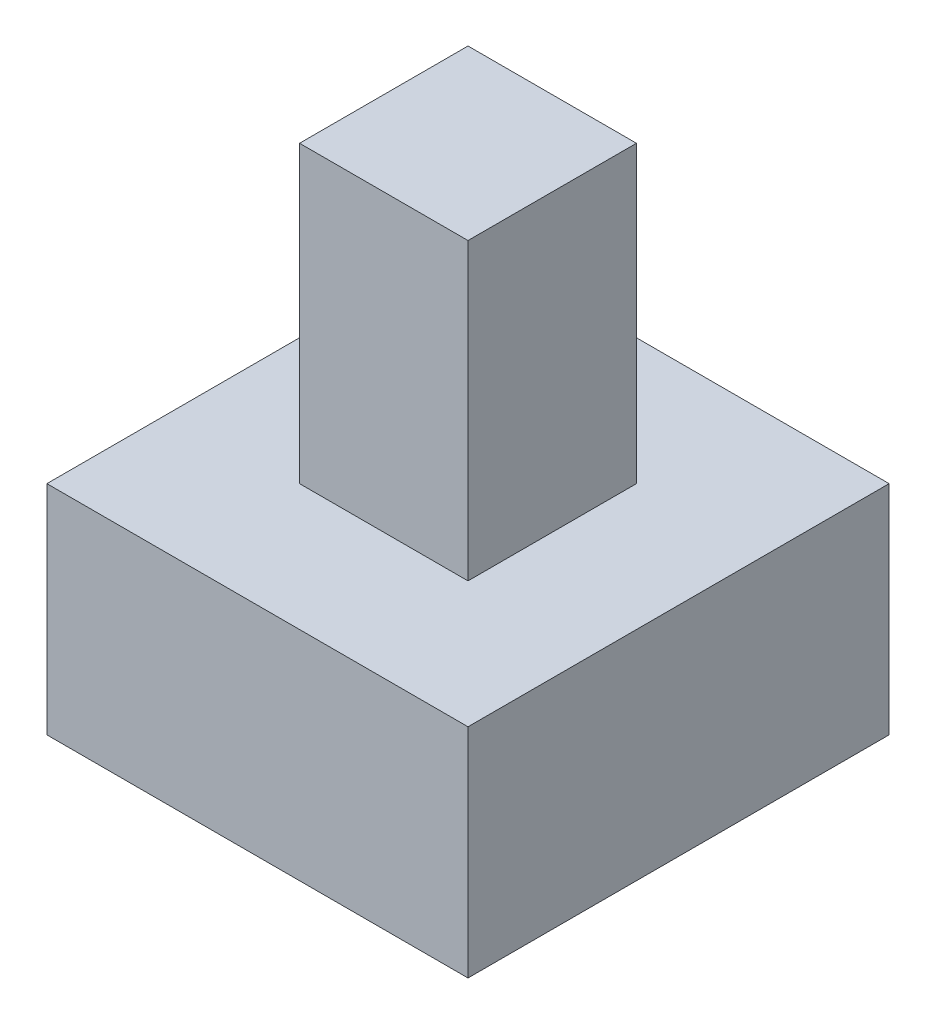
ISO-10303-21;
HEADER;
FILE_DESCRIPTION(('STEP AP214'),'2;1');
FILE_NAME('part.step','',(''),(''),'','','');
FILE_SCHEMA(('AUTOMOTIVE_DESIGN { 1 0 10303 214 1 1 1 1 }'));
ENDSEC;
DATA;
#1=APPLICATION_CONTEXT('core data for automotive mechanical design processes');
#2=APPLICATION_PROTOCOL_DEFINITION('international standard','automotive_design',2000,#1);
#3=PRODUCT_CONTEXT('',#1,'mechanical');
#4=PRODUCT('Part','Part','',(#3));
#5=PRODUCT_RELATED_PRODUCT_CATEGORY('part','',(#4));
#6=PRODUCT_DEFINITION_FORMATION('','',#4);
#7=PRODUCT_DEFINITION_CONTEXT('part definition',#1,'design');
#8=PRODUCT_DEFINITION('design','',#6,#7);
#9=PRODUCT_DEFINITION_SHAPE('','',#8);
#10=(LENGTH_UNIT() NAMED_UNIT(*) SI_UNIT(.MILLI.,.METRE.));
#11=(NAMED_UNIT(*) PLANE_ANGLE_UNIT() SI_UNIT($,.RADIAN.));
#12=(NAMED_UNIT(*) SI_UNIT($,.STERADIAN.) SOLID_ANGLE_UNIT());
#13=UNCERTAINTY_MEASURE_WITH_UNIT(LENGTH_MEASURE(1.E-05),#10,'distance_accuracy_value','');
#14=(GEOMETRIC_REPRESENTATION_CONTEXT(3) GLOBAL_UNCERTAINTY_ASSIGNED_CONTEXT((#13)) GLOBAL_UNIT_ASSIGNED_CONTEXT((#10,
#11,#12)) REPRESENTATION_CONTEXT('',''));
#15=CARTESIAN_POINT('',(0.,0.,0.));
#16=DIRECTION('',(0.,0.,1.));
#17=DIRECTION('',(1.,0.,0.));
#18=AXIS2_PLACEMENT_3D('',#15,#16,#17);
#19=CARTESIAN_POINT('',(-3.,3.1,2.99999999999999));
#20=DIRECTION('',(0.,1.,0.));
#21=DIRECTION('',(0.,0.,1.));
#22=AXIS2_PLACEMENT_3D('',#19,#20,#21);
#23=PLANE('',#22);
#24=DIRECTION('',(0.,0.,1.));
#25=VECTOR('',#24,1.);
#26=CARTESIAN_POINT('',(-3.,3.1,-3.00000000000001));
#27=LINE('',#26,#25);
#28=CARTESIAN_POINT('',(-3.,3.1,-3.00000000000001));
#29=VERTEX_POINT('',#28);
#30=CARTESIAN_POINT('',(-3.,3.1,2.99999999999999));
#31=VERTEX_POINT('',#30);
#32=EDGE_CURVE('E143',#29,#31,#27,.T.);
#33=ORIENTED_EDGE('',*,*,#32,.T.);
#34=DIRECTION('',(1.,0.,0.));
#35=VECTOR('',#34,1.);
#36=CARTESIAN_POINT('',(-3.,3.1,2.99999999999999));
#37=LINE('',#36,#35);
#38=CARTESIAN_POINT('',(3.00000000000002,3.1,2.99999999999999));
#39=VERTEX_POINT('',#38);
#40=EDGE_CURVE('E145',#31,#39,#37,.T.);
#41=ORIENTED_EDGE('',*,*,#40,.T.);
#42=DIRECTION('',(0.,0.,-1.));
#43=VECTOR('',#42,1.);
#44=CARTESIAN_POINT('',(3.,3.1,-3.00000000000001));
#45=LINE('',#44,#43);
#46=CARTESIAN_POINT('',(3.,3.1,-3.00000000000001));
#47=VERTEX_POINT('',#46);
#48=EDGE_CURVE('E147',#39,#47,#45,.T.);
#49=ORIENTED_EDGE('',*,*,#48,.T.);
#50=DIRECTION('',(-1.,0.,0.));
#51=VECTOR('',#50,1.);
#52=CARTESIAN_POINT('',(-3.,3.1,-3.00000000000001));
#53=LINE('',#52,#51);
#54=EDGE_CURVE('E58',#47,#29,#53,.T.);
#55=ORIENTED_EDGE('',*,*,#54,.T.);
#56=EDGE_LOOP('',(#33,#41,#49,#55));
#57=FACE_BOUND('',#56,.T.);
#58=DIRECTION('',(-1.,0.,0.));
#59=VECTOR('',#58,1.);
#60=CARTESIAN_POINT('',(1.2,3.1,-1.2));
#61=LINE('',#60,#59);
#62=CARTESIAN_POINT('',(1.2,3.1,-1.2));
#63=VERTEX_POINT('',#62);
#64=CARTESIAN_POINT('',(-1.2,3.1,-1.2));
#65=VERTEX_POINT('',#64);
#66=EDGE_CURVE('E134',#63,#65,#61,.T.);
#67=ORIENTED_EDGE('',*,*,#66,.F.);
#68=DIRECTION('',(0.,0.,-1.));
#69=VECTOR('',#68,1.);
#70=CARTESIAN_POINT('',(1.2,3.1,1.2));
#71=LINE('',#70,#69);
#72=CARTESIAN_POINT('',(1.2,3.1,1.2));
#73=VERTEX_POINT('',#72);
#74=EDGE_CURVE('E128',#73,#63,#71,.T.);
#75=ORIENTED_EDGE('',*,*,#74,.F.);
#76=DIRECTION('',(1.,0.,0.));
#77=VECTOR('',#76,1.);
#78=CARTESIAN_POINT('',(1.2,3.1,1.2));
#79=LINE('',#78,#77);
#80=CARTESIAN_POINT('',(-1.2,3.1,1.2));
#81=VERTEX_POINT('',#80);
#82=EDGE_CURVE('E107',#81,#73,#79,.T.);
#83=ORIENTED_EDGE('',*,*,#82,.F.);
#84=DIRECTION('',(0.,0.,1.));
#85=VECTOR('',#84,1.);
#86=CARTESIAN_POINT('',(-1.2,3.1,1.2));
#87=LINE('',#86,#85);
#88=EDGE_CURVE('E50',#65,#81,#87,.T.);
#89=ORIENTED_EDGE('',*,*,#88,.F.);
#90=EDGE_LOOP('',(#67,#75,#83,#89));
#91=FACE_BOUND('',#90,.T.);
#92=ADVANCED_FACE('F35',(#57,#91),#23,.T.);
#93=CARTESIAN_POINT('',(-3.,3.1,-3.00000000000001));
#94=DIRECTION('',(1.,0.,0.));
#95=DIRECTION('',(0.,0.,-1.));
#96=AXIS2_PLACEMENT_3D('',#93,#94,#95);
#97=PLANE('',#96);
#98=DIRECTION('',(0.,0.,1.));
#99=VECTOR('',#98,1.);
#100=CARTESIAN_POINT('',(-3.,0.,-3.00000000000001));
#101=LINE('',#100,#99);
#102=CARTESIAN_POINT('',(-3.,0.,-3.00000000000001));
#103=VERTEX_POINT('',#102);
#104=CARTESIAN_POINT('',(-3.,0.,2.99999999999999));
#105=VERTEX_POINT('',#104);
#106=EDGE_CURVE('E121',#103,#105,#101,.T.);
#107=ORIENTED_EDGE('',*,*,#106,.T.);
#108=DIRECTION('',(0.,-1.,0.));
#109=VECTOR('',#108,1.);
#110=CARTESIAN_POINT('',(-3.,3.1,2.99999999999999));
#111=LINE('',#110,#109);
#112=EDGE_CURVE('E12',#31,#105,#111,.T.);
#113=ORIENTED_EDGE('',*,*,#112,.F.);
#114=ORIENTED_EDGE('',*,*,#32,.F.);
#115=DIRECTION('',(0.,-1.,0.));
#116=VECTOR('',#115,1.);
#117=CARTESIAN_POINT('',(-3.,3.1,-3.00000000000001));
#118=LINE('',#117,#116);
#119=EDGE_CURVE('E150',#29,#103,#118,.T.);
#120=ORIENTED_EDGE('',*,*,#119,.T.);
#121=EDGE_LOOP('',(#107,#113,#114,#120));
#122=FACE_BOUND('',#121,.T.);
#123=ADVANCED_FACE('F37',(#122),#97,.F.);
#124=CARTESIAN_POINT('',(-3.,3.1,2.99999999999999));
#125=DIRECTION('',(0.,0.,-1.));
#126=DIRECTION('',(-1.,0.,0.));
#127=AXIS2_PLACEMENT_3D('',#124,#125,#126);
#128=PLANE('',#127);
#129=DIRECTION('',(1.,0.,0.));
#130=VECTOR('',#129,1.);
#131=CARTESIAN_POINT('',(-3.,0.,2.99999999999999));
#132=LINE('',#131,#130);
#133=CARTESIAN_POINT('',(3.00000000000002,0.,2.99999999999999));
#134=VERTEX_POINT('',#133);
#135=EDGE_CURVE('E124',#105,#134,#132,.T.);
#136=ORIENTED_EDGE('',*,*,#135,.T.);
#137=DIRECTION('',(0.,-1.,0.));
#138=VECTOR('',#137,1.);
#139=CARTESIAN_POINT('',(3.00000000000002,3.1,2.99999999999999));
#140=LINE('',#139,#138);
#141=EDGE_CURVE('E43',#39,#134,#140,.T.);
#142=ORIENTED_EDGE('',*,*,#141,.F.);
#143=ORIENTED_EDGE('',*,*,#40,.F.);
#144=ORIENTED_EDGE('',*,*,#112,.T.);
#145=EDGE_LOOP('',(#136,#142,#143,#144));
#146=FACE_BOUND('',#145,.T.);
#147=ADVANCED_FACE('F173',(#146),#128,.F.);
#148=CARTESIAN_POINT('',(3.,3.1,-3.00000000000001));
#149=DIRECTION('',(-1.,0.,0.));
#150=DIRECTION('',(0.,0.,1.));
#151=AXIS2_PLACEMENT_3D('',#148,#149,#150);
#152=PLANE('',#151);
#153=DIRECTION('',(0.,0.,-1.));
#154=VECTOR('',#153,1.);
#155=CARTESIAN_POINT('',(3.,0.,-3.00000000000001));
#156=LINE('',#155,#154);
#157=CARTESIAN_POINT('',(3.,0.,-3.00000000000001));
#158=VERTEX_POINT('',#157);
#159=EDGE_CURVE('E139',#134,#158,#156,.T.);
#160=ORIENTED_EDGE('',*,*,#159,.T.);
#161=DIRECTION('',(0.,-1.,0.));
#162=VECTOR('',#161,1.);
#163=CARTESIAN_POINT('',(3.,3.1,-3.00000000000001));
#164=LINE('',#163,#162);
#165=EDGE_CURVE('E153',#47,#158,#164,.T.);
#166=ORIENTED_EDGE('',*,*,#165,.F.);
#167=ORIENTED_EDGE('',*,*,#48,.F.);
#168=ORIENTED_EDGE('',*,*,#141,.T.);
#169=EDGE_LOOP('',(#160,#166,#167,#168));
#170=FACE_BOUND('',#169,.T.);
#171=ADVANCED_FACE('F160',(#170),#152,.F.);
#172=CARTESIAN_POINT('',(-3.,3.1,-3.00000000000001));
#173=DIRECTION('',(0.,0.,1.));
#174=DIRECTION('',(1.,0.,0.));
#175=AXIS2_PLACEMENT_3D('',#172,#173,#174);
#176=PLANE('',#175);
#177=DIRECTION('',(-1.,0.,0.));
#178=VECTOR('',#177,1.);
#179=CARTESIAN_POINT('',(-3.,0.,-3.00000000000001));
#180=LINE('',#179,#178);
#181=EDGE_CURVE('E141',#158,#103,#180,.T.);
#182=ORIENTED_EDGE('',*,*,#181,.T.);
#183=ORIENTED_EDGE('',*,*,#119,.F.);
#184=ORIENTED_EDGE('',*,*,#54,.F.);
#185=ORIENTED_EDGE('',*,*,#165,.T.);
#186=EDGE_LOOP('',(#182,#183,#184,#185));
#187=FACE_BOUND('',#186,.T.);
#188=ADVANCED_FACE('F168',(#187),#176,.F.);
#189=CARTESIAN_POINT('',(-3.,0.,2.99999999999999));
#190=DIRECTION('',(0.,1.,0.));
#191=DIRECTION('',(0.,0.,1.));
#192=AXIS2_PLACEMENT_3D('',#189,#190,#191);
#193=PLANE('',#192);
#194=ORIENTED_EDGE('',*,*,#106,.F.);
#195=ORIENTED_EDGE('',*,*,#181,.F.);
#196=ORIENTED_EDGE('',*,*,#159,.F.);
#197=ORIENTED_EDGE('',*,*,#135,.F.);
#198=EDGE_LOOP('',(#194,#195,#196,#197));
#199=FACE_BOUND('',#198,.T.);
#200=ADVANCED_FACE('F166',(#199),#193,.F.);
#201=CARTESIAN_POINT('',(1.2,17.9941125496954,1.2));
#202=DIRECTION('',(-1.,0.,0.));
#203=DIRECTION('',(0.,0.,1.));
#204=AXIS2_PLACEMENT_3D('',#201,#202,#203);
#205=PLANE('',#204);
#206=DIRECTION('',(0.,0.,-1.));
#207=VECTOR('',#206,1.);
#208=CARTESIAN_POINT('',(1.2,7.3,1.2));
#209=LINE('',#208,#207);
#210=CARTESIAN_POINT('',(1.2,7.3,1.2));
#211=VERTEX_POINT('',#210);
#212=CARTESIAN_POINT('',(1.2,7.3,-1.2));
#213=VERTEX_POINT('',#212);
#214=EDGE_CURVE('E116',#211,#213,#209,.T.);
#215=ORIENTED_EDGE('',*,*,#214,.F.);
#216=DIRECTION('',(0.,-1.,0.));
#217=VECTOR('',#216,1.);
#218=CARTESIAN_POINT('',(1.2,17.9941125496954,1.2));
#219=LINE('',#218,#217);
#220=EDGE_CURVE('E112',#211,#73,#219,.T.);
#221=ORIENTED_EDGE('',*,*,#220,.T.);
#222=ORIENTED_EDGE('',*,*,#74,.T.);
#223=DIRECTION('',(0.,-1.,0.));
#224=VECTOR('',#223,1.);
#225=CARTESIAN_POINT('',(1.2,17.9941125496954,-1.2));
#226=LINE('',#225,#224);
#227=EDGE_CURVE('E132',#213,#63,#226,.T.);
#228=ORIENTED_EDGE('',*,*,#227,.F.);
#229=EDGE_LOOP('',(#215,#221,#222,#228));
#230=FACE_BOUND('',#229,.T.);
#231=ADVANCED_FACE('F191',(#230),#205,.F.);
#232=CARTESIAN_POINT('',(1.2,17.9941125496954,-1.2));
#233=DIRECTION('',(0.,0.,1.));
#234=DIRECTION('',(1.,0.,0.));
#235=AXIS2_PLACEMENT_3D('',#232,#233,#234);
#236=PLANE('',#235);
#237=DIRECTION('',(-1.,0.,0.));
#238=VECTOR('',#237,1.);
#239=CARTESIAN_POINT('',(1.2,7.3,-1.2));
#240=LINE('',#239,#238);
#241=CARTESIAN_POINT('',(-1.2,7.3,-1.2));
#242=VERTEX_POINT('',#241);
#243=EDGE_CURVE('E120',#213,#242,#240,.T.);
#244=ORIENTED_EDGE('',*,*,#243,.F.);
#245=ORIENTED_EDGE('',*,*,#227,.T.);
#246=ORIENTED_EDGE('',*,*,#66,.T.);
#247=DIRECTION('',(0.,-1.,0.));
#248=VECTOR('',#247,1.);
#249=CARTESIAN_POINT('',(-1.2,17.9941125496954,-1.2));
#250=LINE('',#249,#248);
#251=EDGE_CURVE('E135',#242,#65,#250,.T.);
#252=ORIENTED_EDGE('',*,*,#251,.F.);
#253=EDGE_LOOP('',(#244,#245,#246,#252));
#254=FACE_BOUND('',#253,.T.);
#255=ADVANCED_FACE('F195',(#254),#236,.F.);
#256=CARTESIAN_POINT('',(-1.2,17.9941125496954,1.2));
#257=DIRECTION('',(1.,0.,0.));
#258=DIRECTION('',(0.,0.,-1.));
#259=AXIS2_PLACEMENT_3D('',#256,#257,#258);
#260=PLANE('',#259);
#261=DIRECTION('',(0.,0.,1.));
#262=VECTOR('',#261,1.);
#263=CARTESIAN_POINT('',(-1.2,7.3,1.2));
#264=LINE('',#263,#262);
#265=CARTESIAN_POINT('',(-1.2,7.3,1.2));
#266=VERTEX_POINT('',#265);
#267=EDGE_CURVE('E102',#242,#266,#264,.T.);
#268=ORIENTED_EDGE('',*,*,#267,.F.);
#269=ORIENTED_EDGE('',*,*,#251,.T.);
#270=ORIENTED_EDGE('',*,*,#88,.T.);
#271=DIRECTION('',(0.,-1.,0.));
#272=VECTOR('',#271,1.);
#273=CARTESIAN_POINT('',(-1.2,17.9941125496954,1.2));
#274=LINE('',#273,#272);
#275=EDGE_CURVE('E98',#266,#81,#274,.T.);
#276=ORIENTED_EDGE('',*,*,#275,.F.);
#277=EDGE_LOOP('',(#268,#269,#270,#276));
#278=FACE_BOUND('',#277,.T.);
#279=ADVANCED_FACE('F100',(#278),#260,.F.);
#280=CARTESIAN_POINT('',(1.2,17.9941125496954,1.2));
#281=DIRECTION('',(0.,0.,-1.));
#282=DIRECTION('',(-1.,0.,0.));
#283=AXIS2_PLACEMENT_3D('',#280,#281,#282);
#284=PLANE('',#283);
#285=DIRECTION('',(1.,0.,0.));
#286=VECTOR('',#285,1.);
#287=CARTESIAN_POINT('',(1.2,7.3,1.2));
#288=LINE('',#287,#286);
#289=EDGE_CURVE('E110',#266,#211,#288,.T.);
#290=ORIENTED_EDGE('',*,*,#289,.F.);
#291=ORIENTED_EDGE('',*,*,#275,.T.);
#292=ORIENTED_EDGE('',*,*,#82,.T.);
#293=ORIENTED_EDGE('',*,*,#220,.F.);
#294=EDGE_LOOP('',(#290,#291,#292,#293));
#295=FACE_BOUND('',#294,.T.);
#296=ADVANCED_FACE('F111',(#295),#284,.F.);
#297=CARTESIAN_POINT('',(-3.,7.3,2.99999999999999));
#298=DIRECTION('',(0.,1.,0.));
#299=DIRECTION('',(0.,0.,1.));
#300=AXIS2_PLACEMENT_3D('',#297,#298,#299);
#301=PLANE('',#300);
#302=ORIENTED_EDGE('',*,*,#289,.T.);
#303=ORIENTED_EDGE('',*,*,#214,.T.);
#304=ORIENTED_EDGE('',*,*,#243,.T.);
#305=ORIENTED_EDGE('',*,*,#267,.T.);
#306=EDGE_LOOP('',(#302,#303,#304,#305));
#307=FACE_BOUND('',#306,.T.);
#308=ADVANCED_FACE('F119',(#307),#301,.T.);
#309=CLOSED_SHELL('',(#92,#123,#147,#171,#188,#200,#231,#255,#279,#296,#308));
#310=MANIFOLD_SOLID_BREP('B2',#309);
#311=ADVANCED_BREP_SHAPE_REPRESENTATION('',(#18,#310),#14);
#312=SHAPE_DEFINITION_REPRESENTATION(#9,#311);
ENDSEC;
END-ISO-10303-21;
